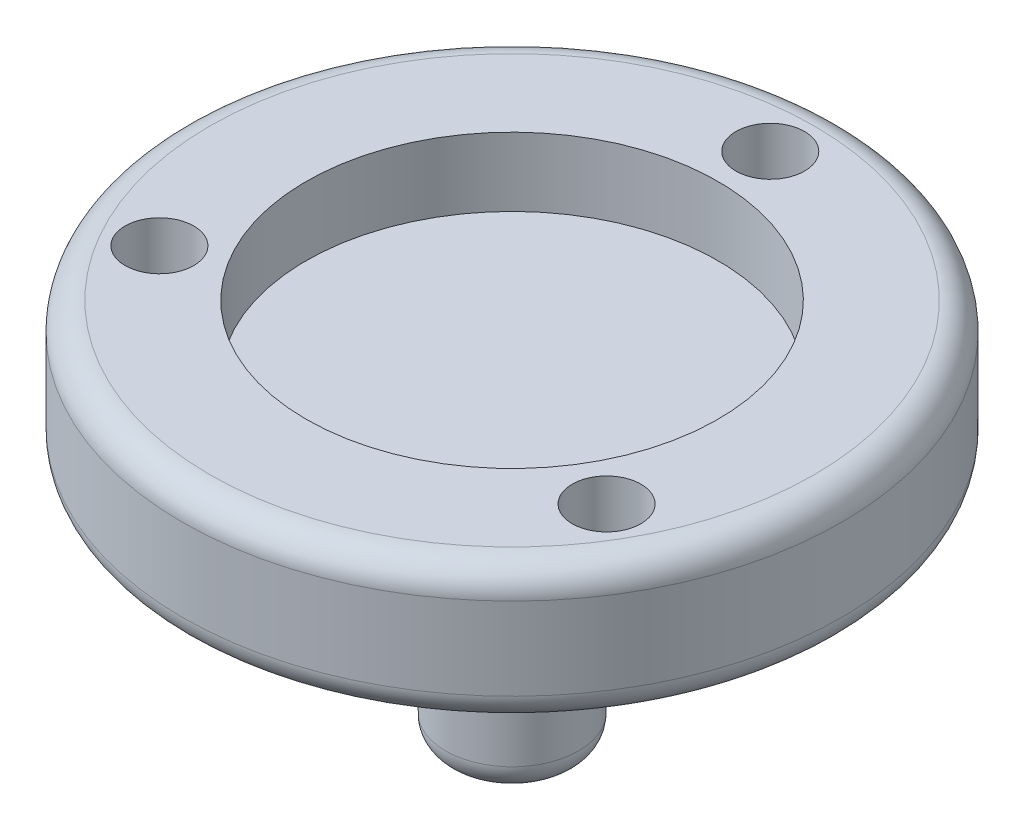
ISO-10303-21;
HEADER;
FILE_DESCRIPTION(('STEP AP214'),'2;1');
FILE_NAME('part.step','',(''),(''),'','','');
FILE_SCHEMA(('AUTOMOTIVE_DESIGN { 1 0 10303 214 1 1 1 1 }'));
ENDSEC;
DATA;
#1=APPLICATION_CONTEXT('core data for automotive mechanical design processes');
#2=APPLICATION_PROTOCOL_DEFINITION('international standard','automotive_design',2000,#1);
#3=PRODUCT_CONTEXT('',#1,'mechanical');
#4=PRODUCT('Part','Part','',(#3));
#5=PRODUCT_RELATED_PRODUCT_CATEGORY('part','',(#4));
#6=PRODUCT_DEFINITION_FORMATION('','',#4);
#7=PRODUCT_DEFINITION_CONTEXT('part definition',#1,'design');
#8=PRODUCT_DEFINITION('design','',#6,#7);
#9=PRODUCT_DEFINITION_SHAPE('','',#8);
#10=(LENGTH_UNIT() NAMED_UNIT(*) SI_UNIT(.MILLI.,.METRE.));
#11=(NAMED_UNIT(*) PLANE_ANGLE_UNIT() SI_UNIT($,.RADIAN.));
#12=(NAMED_UNIT(*) SI_UNIT($,.STERADIAN.) SOLID_ANGLE_UNIT());
#13=UNCERTAINTY_MEASURE_WITH_UNIT(LENGTH_MEASURE(1.E-05),#10,'distance_accuracy_value','');
#14=(GEOMETRIC_REPRESENTATION_CONTEXT(3) GLOBAL_UNCERTAINTY_ASSIGNED_CONTEXT((#13)) GLOBAL_UNIT_ASSIGNED_CONTEXT((#10,
#11,#12)) REPRESENTATION_CONTEXT('',''));
#15=CARTESIAN_POINT('',(0.,0.,0.));
#16=DIRECTION('',(0.,0.,1.));
#17=DIRECTION('',(1.,0.,0.));
#18=AXIS2_PLACEMENT_3D('',#15,#16,#17);
#19=CARTESIAN_POINT('',(0.,6.35,0.));
#20=DIRECTION('',(0.,-1.,0.));
#21=DIRECTION('',(0.,0.,-1.));
#22=AXIS2_PLACEMENT_3D('',#19,#20,#21);
#23=CYLINDRICAL_SURFACE('',#22,15.24);
#24=CARTESIAN_POINT('',(0.,1.27,0.));
#25=DIRECTION('',(0.,1.,0.));
#26=DIRECTION('',(0.,0.,1.));
#27=AXIS2_PLACEMENT_3D('',#24,#25,#26);
#28=CIRCLE('',#27,15.24);
#29=CARTESIAN_POINT('',(0.,1.27,15.24));
#30=VERTEX_POINT('',#29);
#31=EDGE_CURVE('E50',#30,#30,#28,.T.);
#32=ORIENTED_EDGE('',*,*,#31,.T.);
#33=EDGE_LOOP('',(#32));
#34=FACE_BOUND('',#33,.T.);
#35=CARTESIAN_POINT('',(0.,5.08,0.));
#36=DIRECTION('',(0.,1.,0.));
#37=DIRECTION('',(0.,0.,1.));
#38=AXIS2_PLACEMENT_3D('',#35,#36,#37);
#39=CIRCLE('',#38,15.24);
#40=CARTESIAN_POINT('',(0.,5.08,15.24));
#41=VERTEX_POINT('',#40);
#42=EDGE_CURVE('E69',#41,#41,#39,.F.);
#43=ORIENTED_EDGE('',*,*,#42,.T.);
#44=EDGE_LOOP('',(#43));
#45=FACE_BOUND('',#44,.T.);
#46=ADVANCED_FACE('F37',(#34,#45),#23,.T.);
#47=CARTESIAN_POINT('',(0.,6.35,0.));
#48=DIRECTION('',(0.,1.,0.));
#49=DIRECTION('',(0.,0.,1.));
#50=AXIS2_PLACEMENT_3D('',#47,#48,#49);
#51=PLANE('',#50);
#52=CARTESIAN_POINT('',(10.3386112703786,6.35,5.96900000000005));
#53=DIRECTION('',(0.,1.,0.));
#54=DIRECTION('',(-0.866025403784436,0.,-0.500000000000004));
#55=AXIS2_PLACEMENT_3D('',#52,#53,#54);
#56=CIRCLE('',#55,1.5875);
#57=CARTESIAN_POINT('',(8.96379594187081,6.35,5.17525000000004));
#58=VERTEX_POINT('',#57);
#59=EDGE_CURVE('E102',#58,#58,#56,.T.);
#60=ORIENTED_EDGE('',*,*,#59,.F.);
#61=EDGE_LOOP('',(#60));
#62=FACE_BOUND('',#61,.T.);
#63=CARTESIAN_POINT('',(-10.3386112703787,6.35,5.9689999999999));
#64=DIRECTION('',(0.,1.,0.));
#65=DIRECTION('',(0.866025403784443,0.,-0.499999999999992));
#66=AXIS2_PLACEMENT_3D('',#63,#64,#65);
#67=CIRCLE('',#66,1.5875);
#68=CARTESIAN_POINT('',(-8.96379594187088,6.35,5.17524999999992));
#69=VERTEX_POINT('',#68);
#70=EDGE_CURVE('E94',#69,#69,#67,.T.);
#71=ORIENTED_EDGE('',*,*,#70,.F.);
#72=EDGE_LOOP('',(#71));
#73=FACE_BOUND('',#72,.T.);
#74=CARTESIAN_POINT('',(0.,6.35,-11.938));
#75=DIRECTION('',(0.,1.,0.));
#76=DIRECTION('',(0.,0.,1.));
#77=AXIS2_PLACEMENT_3D('',#74,#75,#76);
#78=CIRCLE('',#77,1.5875);
#79=CARTESIAN_POINT('',(0.,6.35,-10.3505));
#80=VERTEX_POINT('',#79);
#81=EDGE_CURVE('E86',#80,#80,#78,.T.);
#82=ORIENTED_EDGE('',*,*,#81,.F.);
#83=EDGE_LOOP('',(#82));
#84=FACE_BOUND('',#83,.T.);
#85=CARTESIAN_POINT('',(0.,6.35,0.));
#86=DIRECTION('',(0.,1.,0.));
#87=DIRECTION('',(0.,0.,1.));
#88=AXIS2_PLACEMENT_3D('',#85,#86,#87);
#89=CIRCLE('',#88,13.97);
#90=CARTESIAN_POINT('',(0.,6.35,13.97));
#91=VERTEX_POINT('',#90);
#92=EDGE_CURVE('E73',#91,#91,#89,.T.);
#93=ORIENTED_EDGE('',*,*,#92,.T.);
#94=EDGE_LOOP('',(#93));
#95=FACE_BOUND('',#94,.T.);
#96=CARTESIAN_POINT('',(0.,6.35,0.));
#97=DIRECTION('',(0.,1.,0.));
#98=DIRECTION('',(0.,0.,1.));
#99=AXIS2_PLACEMENT_3D('',#96,#97,#98);
#100=CIRCLE('',#99,9.525);
#101=CARTESIAN_POINT('',(0.,6.35,9.525));
#102=VERTEX_POINT('',#101);
#103=EDGE_CURVE('E78',#102,#102,#100,.T.);
#104=ORIENTED_EDGE('',*,*,#103,.F.);
#105=EDGE_LOOP('',(#104));
#106=FACE_BOUND('',#105,.T.);
#107=ADVANCED_FACE('F119',(#62,#73,#84,#95,#106),#51,.T.);
#108=CARTESIAN_POINT('',(0.,0.,0.));
#109=DIRECTION('',(0.,1.,0.));
#110=DIRECTION('',(0.,0.,1.));
#111=AXIS2_PLACEMENT_3D('',#108,#109,#110);
#112=PLANE('',#111);
#113=CARTESIAN_POINT('',(0.,0.,0.));
#114=DIRECTION('',(0.,1.,0.));
#115=DIRECTION('',(0.,0.,1.));
#116=AXIS2_PLACEMENT_3D('',#113,#114,#115);
#117=CIRCLE('',#116,13.97);
#118=CARTESIAN_POINT('',(0.,0.,13.97));
#119=VERTEX_POINT('',#118);
#120=EDGE_CURVE('E10',#119,#119,#117,.F.);
#121=ORIENTED_EDGE('',*,*,#120,.T.);
#122=EDGE_LOOP('',(#121));
#123=FACE_BOUND('',#122,.T.);
#124=CARTESIAN_POINT('',(0.,0.,0.));
#125=DIRECTION('',(0.,1.,0.));
#126=DIRECTION('',(0.,0.,1.));
#127=AXIS2_PLACEMENT_3D('',#124,#125,#126);
#128=CIRCLE('',#127,4.3434);
#129=CARTESIAN_POINT('',(0.,0.,4.3434));
#130=VERTEX_POINT('',#129);
#131=EDGE_CURVE('E45',#130,#130,#128,.T.);
#132=ORIENTED_EDGE('',*,*,#131,.T.);
#133=EDGE_LOOP('',(#132));
#134=FACE_BOUND('',#133,.T.);
#135=ADVANCED_FACE('F122',(#123,#134),#112,.F.);
#136=CARTESIAN_POINT('',(0.,3.175,0.));
#137=DIRECTION('',(0.,1.,0.));
#138=DIRECTION('',(0.,0.,1.));
#139=AXIS2_PLACEMENT_3D('',#136,#137,#138);
#140=CYLINDRICAL_SURFACE('',#139,9.525);
#141=CARTESIAN_POINT('',(0.,3.175,0.));
#142=DIRECTION('',(0.,1.,0.));
#143=DIRECTION('',(0.,0.,1.));
#144=AXIS2_PLACEMENT_3D('',#141,#142,#143);
#145=CIRCLE('',#144,9.525);
#146=CARTESIAN_POINT('',(0.,3.175,9.525));
#147=VERTEX_POINT('',#146);
#148=EDGE_CURVE('E77',#147,#147,#145,.T.);
#149=ORIENTED_EDGE('',*,*,#148,.F.);
#150=EDGE_LOOP('',(#149));
#151=FACE_BOUND('',#150,.T.);
#152=ORIENTED_EDGE('',*,*,#103,.T.);
#153=EDGE_LOOP('',(#152));
#154=FACE_BOUND('',#153,.T.);
#155=ADVANCED_FACE('F132',(#151,#154),#140,.F.);
#156=CARTESIAN_POINT('',(0.,3.175,0.));
#157=DIRECTION('',(0.,1.,0.));
#158=DIRECTION('',(0.,0.,1.));
#159=AXIS2_PLACEMENT_3D('',#156,#157,#158);
#160=PLANE('',#159);
#161=ORIENTED_EDGE('',*,*,#148,.T.);
#162=EDGE_LOOP('',(#161));
#163=FACE_BOUND('',#162,.T.);
#164=ADVANCED_FACE('F134',(#163),#160,.T.);
#165=CARTESIAN_POINT('',(0.,5.08,0.));
#166=DIRECTION('',(0.,1.,0.));
#167=DIRECTION('',(0.,0.,1.));
#168=AXIS2_PLACEMENT_3D('',#165,#166,#167);
#169=TOROIDAL_SURFACE('',#168,13.97,1.27);
#170=ORIENTED_EDGE('',*,*,#42,.F.);
#171=EDGE_LOOP('',(#170));
#172=FACE_BOUND('',#171,.T.);
#173=ORIENTED_EDGE('',*,*,#92,.F.);
#174=EDGE_LOOP('',(#173));
#175=FACE_BOUND('',#174,.T.);
#176=ADVANCED_FACE('F141',(#172,#175),#169,.T.);
#177=CARTESIAN_POINT('',(0.,-11.43,0.));
#178=DIRECTION('',(0.,1.,0.));
#179=DIRECTION('',(0.,0.,1.));
#180=AXIS2_PLACEMENT_3D('',#177,#178,#179);
#181=CYLINDRICAL_SURFACE('',#180,3.0734);
#182=CARTESIAN_POINT('',(0.,-10.16,0.));
#183=DIRECTION('',(0.,-1.,0.));
#184=DIRECTION('',(0.,0.,-1.));
#185=AXIS2_PLACEMENT_3D('',#182,#183,#184);
#186=CIRCLE('',#185,3.0734);
#187=CARTESIAN_POINT('',(0.,-10.16,-3.0734));
#188=VERTEX_POINT('',#187);
#189=EDGE_CURVE('E55',#188,#188,#186,.F.);
#190=ORIENTED_EDGE('',*,*,#189,.T.);
#191=EDGE_LOOP('',(#190));
#192=FACE_BOUND('',#191,.T.);
#193=CARTESIAN_POINT('',(0.,-1.27,0.));
#194=DIRECTION('',(0.,1.,0.));
#195=DIRECTION('',(0.,0.,1.));
#196=AXIS2_PLACEMENT_3D('',#193,#194,#195);
#197=CIRCLE('',#196,3.0734);
#198=CARTESIAN_POINT('',(0.,-1.27,3.0734));
#199=VERTEX_POINT('',#198);
#200=EDGE_CURVE('E61',#199,#199,#197,.F.);
#201=ORIENTED_EDGE('',*,*,#200,.T.);
#202=EDGE_LOOP('',(#201));
#203=FACE_BOUND('',#202,.T.);
#204=ADVANCED_FACE('F155',(#192,#203),#181,.T.);
#205=CARTESIAN_POINT('',(0.,-11.43,0.));
#206=DIRECTION('',(0.,-1.,0.));
#207=DIRECTION('',(0.,0.,-1.));
#208=AXIS2_PLACEMENT_3D('',#205,#206,#207);
#209=PLANE('',#208);
#210=CARTESIAN_POINT('',(0.,-11.43,0.));
#211=DIRECTION('',(0.,-1.,0.));
#212=DIRECTION('',(0.,0.,-1.));
#213=AXIS2_PLACEMENT_3D('',#210,#211,#212);
#214=CIRCLE('',#213,1.8034);
#215=CARTESIAN_POINT('',(0.,-11.43,-1.8034));
#216=VERTEX_POINT('',#215);
#217=EDGE_CURVE('E65',#216,#216,#214,.T.);
#218=ORIENTED_EDGE('',*,*,#217,.T.);
#219=EDGE_LOOP('',(#218));
#220=FACE_BOUND('',#219,.T.);
#221=ADVANCED_FACE('F160',(#220),#209,.T.);
#222=CARTESIAN_POINT('',(0.,-10.16,0.));
#223=DIRECTION('',(0.,-1.,0.));
#224=DIRECTION('',(0.,0.,-1.));
#225=AXIS2_PLACEMENT_3D('',#222,#223,#224);
#226=TOROIDAL_SURFACE('',#225,1.8034,1.27);
#227=ORIENTED_EDGE('',*,*,#189,.F.);
#228=EDGE_LOOP('',(#227));
#229=FACE_BOUND('',#228,.T.);
#230=ORIENTED_EDGE('',*,*,#217,.F.);
#231=EDGE_LOOP('',(#230));
#232=FACE_BOUND('',#231,.T.);
#233=ADVANCED_FACE('F157',(#229,#232),#226,.T.);
#234=CARTESIAN_POINT('',(0.,1.27,0.));
#235=DIRECTION('',(0.,1.,0.));
#236=DIRECTION('',(0.,0.,1.));
#237=AXIS2_PLACEMENT_3D('',#234,#235,#236);
#238=TOROIDAL_SURFACE('',#237,13.97,1.27);
#239=ORIENTED_EDGE('',*,*,#120,.F.);
#240=EDGE_LOOP('',(#239));
#241=FACE_BOUND('',#240,.T.);
#242=ORIENTED_EDGE('',*,*,#31,.F.);
#243=EDGE_LOOP('',(#242));
#244=FACE_BOUND('',#243,.T.);
#245=ADVANCED_FACE('F159',(#241,#244),#238,.T.);
#246=CARTESIAN_POINT('',(0.,-1.27,0.));
#247=DIRECTION('',(0.,1.,0.));
#248=DIRECTION('',(0.,0.,1.));
#249=AXIS2_PLACEMENT_3D('',#246,#247,#248);
#250=TOROIDAL_SURFACE('',#249,4.3434,1.27);
#251=ORIENTED_EDGE('',*,*,#131,.F.);
#252=EDGE_LOOP('',(#251));
#253=FACE_BOUND('',#252,.T.);
#254=ORIENTED_EDGE('',*,*,#200,.F.);
#255=EDGE_LOOP('',(#254));
#256=FACE_BOUND('',#255,.T.);
#257=ADVANCED_FACE('F39',(#253,#256),#250,.F.);
#258=CARTESIAN_POINT('',(0.,3.81,-11.938));
#259=DIRECTION('',(0.,1.,0.));
#260=DIRECTION('',(0.,0.,1.));
#261=AXIS2_PLACEMENT_3D('',#258,#259,#260);
#262=CYLINDRICAL_SURFACE('',#261,1.5875);
#263=CARTESIAN_POINT('',(0.,3.81,-11.938));
#264=DIRECTION('',(0.,1.,0.));
#265=DIRECTION('',(0.,0.,1.));
#266=AXIS2_PLACEMENT_3D('',#263,#264,#265);
#267=CIRCLE('',#266,1.5875);
#268=CARTESIAN_POINT('',(0.,3.81,-10.3505));
#269=VERTEX_POINT('',#268);
#270=EDGE_CURVE('E82',#269,#269,#267,.T.);
#271=ORIENTED_EDGE('',*,*,#270,.F.);
#272=EDGE_LOOP('',(#271));
#273=FACE_BOUND('',#272,.T.);
#274=ORIENTED_EDGE('',*,*,#81,.T.);
#275=EDGE_LOOP('',(#274));
#276=FACE_BOUND('',#275,.T.);
#277=ADVANCED_FACE('F167',(#273,#276),#262,.F.);
#278=CARTESIAN_POINT('',(0.,3.81,-11.938));
#279=DIRECTION('',(0.,1.,0.));
#280=DIRECTION('',(0.,0.,1.));
#281=AXIS2_PLACEMENT_3D('',#278,#279,#280);
#282=PLANE('',#281);
#283=ORIENTED_EDGE('',*,*,#270,.T.);
#284=EDGE_LOOP('',(#283));
#285=FACE_BOUND('',#284,.T.);
#286=ADVANCED_FACE('F174',(#285),#282,.T.);
#287=CARTESIAN_POINT('',(-10.3386112703787,3.81,5.9689999999999));
#288=DIRECTION('',(0.,1.,0.));
#289=DIRECTION('',(0.,0.,1.));
#290=AXIS2_PLACEMENT_3D('',#287,#288,#289);
#291=CYLINDRICAL_SURFACE('',#290,1.5875);
#292=CARTESIAN_POINT('',(-10.3386112703787,3.81,5.9689999999999));
#293=DIRECTION('',(0.,1.,0.));
#294=DIRECTION('',(0.866025403784443,0.,-0.499999999999992));
#295=AXIS2_PLACEMENT_3D('',#292,#293,#294);
#296=CIRCLE('',#295,1.5875);
#297=CARTESIAN_POINT('',(-8.96379594187088,3.81,5.17524999999992));
#298=VERTEX_POINT('',#297);
#299=EDGE_CURVE('E98',#298,#298,#296,.T.);
#300=ORIENTED_EDGE('',*,*,#299,.F.);
#301=EDGE_LOOP('',(#300));
#302=FACE_BOUND('',#301,.T.);
#303=ORIENTED_EDGE('',*,*,#70,.T.);
#304=EDGE_LOOP('',(#303));
#305=FACE_BOUND('',#304,.T.);
#306=ADVANCED_FACE('F191',(#302,#305),#291,.F.);
#307=CARTESIAN_POINT('',(-10.3386112703787,3.81,5.9689999999999));
#308=DIRECTION('',(0.,1.,0.));
#309=DIRECTION('',(0.866025403784443,0.,-0.499999999999992));
#310=AXIS2_PLACEMENT_3D('',#307,#308,#309);
#311=PLANE('',#310);
#312=ORIENTED_EDGE('',*,*,#299,.T.);
#313=EDGE_LOOP('',(#312));
#314=FACE_BOUND('',#313,.T.);
#315=ADVANCED_FACE('F115',(#314),#311,.T.);
#316=CARTESIAN_POINT('',(10.3386112703786,3.81,5.96900000000005));
#317=DIRECTION('',(0.,1.,0.));
#318=DIRECTION('',(0.,0.,1.));
#319=AXIS2_PLACEMENT_3D('',#316,#317,#318);
#320=CYLINDRICAL_SURFACE('',#319,1.5875);
#321=CARTESIAN_POINT('',(10.3386112703786,3.81,5.96900000000005));
#322=DIRECTION('',(0.,1.,0.));
#323=DIRECTION('',(-0.866025403784436,0.,-0.500000000000004));
#324=AXIS2_PLACEMENT_3D('',#321,#322,#323);
#325=CIRCLE('',#324,1.5875);
#326=CARTESIAN_POINT('',(8.96379594187081,3.81,5.17525000000004));
#327=VERTEX_POINT('',#326);
#328=EDGE_CURVE('E90',#327,#327,#325,.T.);
#329=ORIENTED_EDGE('',*,*,#328,.F.);
#330=EDGE_LOOP('',(#329));
#331=FACE_BOUND('',#330,.T.);
#332=ORIENTED_EDGE('',*,*,#59,.T.);
#333=EDGE_LOOP('',(#332));
#334=FACE_BOUND('',#333,.T.);
#335=ADVANCED_FACE('F112',(#331,#334),#320,.F.);
#336=CARTESIAN_POINT('',(10.3386112703786,3.81,5.96900000000005));
#337=DIRECTION('',(0.,1.,0.));
#338=DIRECTION('',(-0.866025403784436,0.,-0.500000000000004));
#339=AXIS2_PLACEMENT_3D('',#336,#337,#338);
#340=PLANE('',#339);
#341=ORIENTED_EDGE('',*,*,#328,.T.);
#342=EDGE_LOOP('',(#341));
#343=FACE_BOUND('',#342,.T.);
#344=ADVANCED_FACE('F110',(#343),#340,.T.);
#345=CLOSED_SHELL('',(#46,#107,#135,#155,#164,#176,#204,#221,#233,#245,#257,#277,#286,#306,#315,
#335,#344));
#346=MANIFOLD_SOLID_BREP('B2',#345);
#347=ADVANCED_BREP_SHAPE_REPRESENTATION('',(#18,#346),#14);
#348=SHAPE_DEFINITION_REPRESENTATION(#9,#347);
ENDSEC;
END-ISO-10303-21;
